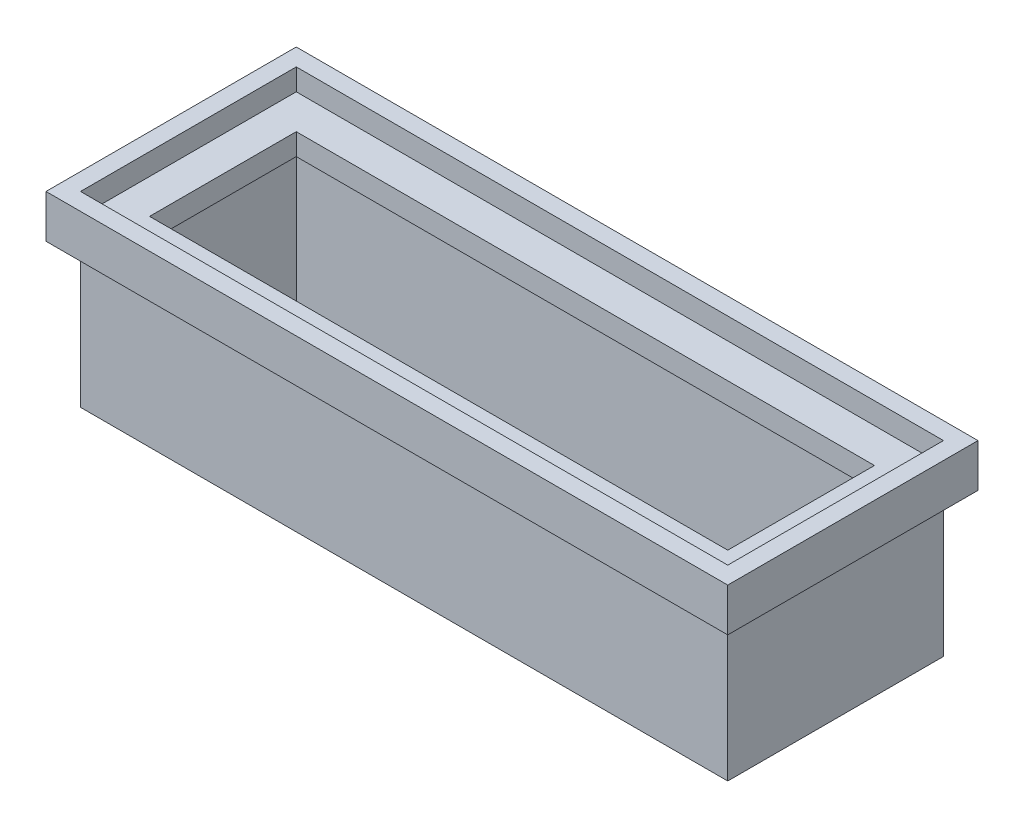
ISO-10303-21;
HEADER;
FILE_DESCRIPTION(('STEP AP214'),'2;1');
FILE_NAME('part.step','',(''),(''),'','','');
FILE_SCHEMA(('AUTOMOTIVE_DESIGN { 1 0 10303 214 1 1 1 1 }'));
ENDSEC;
DATA;
#1=APPLICATION_CONTEXT('core data for automotive mechanical design processes');
#2=APPLICATION_PROTOCOL_DEFINITION('international standard','automotive_design',2000,#1);
#3=PRODUCT_CONTEXT('',#1,'mechanical');
#4=PRODUCT('Part','Part','',(#3));
#5=PRODUCT_RELATED_PRODUCT_CATEGORY('part','',(#4));
#6=PRODUCT_DEFINITION_FORMATION('','',#4);
#7=PRODUCT_DEFINITION_CONTEXT('part definition',#1,'design');
#8=PRODUCT_DEFINITION('design','',#6,#7);
#9=PRODUCT_DEFINITION_SHAPE('','',#8);
#10=(LENGTH_UNIT() NAMED_UNIT(*) SI_UNIT(.MILLI.,.METRE.));
#11=(NAMED_UNIT(*) PLANE_ANGLE_UNIT() SI_UNIT($,.RADIAN.));
#12=(NAMED_UNIT(*) SI_UNIT($,.STERADIAN.) SOLID_ANGLE_UNIT());
#13=UNCERTAINTY_MEASURE_WITH_UNIT(LENGTH_MEASURE(1.E-05),#10,'distance_accuracy_value','');
#14=(GEOMETRIC_REPRESENTATION_CONTEXT(3) GLOBAL_UNCERTAINTY_ASSIGNED_CONTEXT((#13)) GLOBAL_UNIT_ASSIGNED_CONTEXT((#10,
#11,#12)) REPRESENTATION_CONTEXT('',''));
#15=CARTESIAN_POINT('',(0.,0.,0.));
#16=DIRECTION('',(0.,0.,1.));
#17=DIRECTION('',(1.,0.,0.));
#18=AXIS2_PLACEMENT_3D('',#15,#16,#17);
#19=CARTESIAN_POINT('',(0.,13.,0.));
#20=DIRECTION('',(0.,1.,0.));
#21=DIRECTION('',(0.,0.,1.));
#22=AXIS2_PLACEMENT_3D('',#19,#20,#21);
#23=PLANE('',#22);
#24=DIRECTION('',(0.,0.,1.));
#25=VECTOR('',#24,1.);
#26=CARTESIAN_POINT('',(-29.2763157894737,13.,-7.74736842105263));
#27=LINE('',#26,#25);
#28=CARTESIAN_POINT('',(-29.2763157894737,13.,-11.3473684210526));
#29=VERTEX_POINT('',#28);
#30=CARTESIAN_POINT('',(-29.2763157894737,13.,6.05263157894737));
#31=VERTEX_POINT('',#30);
#32=EDGE_CURVE('E271',#29,#31,#27,.T.);
#33=ORIENTED_EDGE('',*,*,#32,.T.);
#34=DIRECTION('',(1.,0.,0.));
#35=VECTOR('',#34,1.);
#36=CARTESIAN_POINT('',(-25.6763157894737,13.,6.05263157894737));
#37=LINE('',#36,#35);
#38=CARTESIAN_POINT('',(18.1236842105263,13.,6.05263157894737));
#39=VERTEX_POINT('',#38);
#40=EDGE_CURVE('E274',#31,#39,#37,.T.);
#41=ORIENTED_EDGE('',*,*,#40,.T.);
#42=DIRECTION('',(0.,0.,1.));
#43=VECTOR('',#42,1.);
#44=CARTESIAN_POINT('',(18.1236842105263,13.,-7.74736842105263));
#45=LINE('',#44,#43);
#46=CARTESIAN_POINT('',(18.1236842105263,13.,-11.3473684210526));
#47=VERTEX_POINT('',#46);
#48=EDGE_CURVE('E277',#47,#39,#45,.T.);
#49=ORIENTED_EDGE('',*,*,#48,.F.);
#50=DIRECTION('',(1.,0.,0.));
#51=VECTOR('',#50,1.);
#52=CARTESIAN_POINT('',(-25.6763157894737,13.,-11.3473684210526));
#53=LINE('',#52,#51);
#54=EDGE_CURVE('E280',#29,#47,#53,.T.);
#55=ORIENTED_EDGE('',*,*,#54,.F.);
#56=EDGE_LOOP('',(#33,#41,#49,#55));
#57=FACE_BOUND('',#56,.T.);
#58=DIRECTION('',(0.,0.,1.));
#59=VECTOR('',#58,1.);
#60=CARTESIAN_POINT('',(-28.0763157894737,13.,-10.1473684210526));
#61=LINE('',#60,#59);
#62=CARTESIAN_POINT('',(-28.0763157894737,13.,-10.1473684210526));
#63=VERTEX_POINT('',#62);
#64=CARTESIAN_POINT('',(-28.0763157894737,13.,4.85263157894737));
#65=VERTEX_POINT('',#64);
#66=EDGE_CURVE('E233',#63,#65,#61,.T.);
#67=ORIENTED_EDGE('',*,*,#66,.F.);
#68=DIRECTION('',(1.,0.,0.));
#69=VECTOR('',#68,1.);
#70=CARTESIAN_POINT('',(-28.0763157894737,13.,-10.1473684210526));
#71=LINE('',#70,#69);
#72=CARTESIAN_POINT('',(16.9236842105263,13.,-10.1473684210526));
#73=VERTEX_POINT('',#72);
#74=EDGE_CURVE('E96',#63,#73,#71,.T.);
#75=ORIENTED_EDGE('',*,*,#74,.T.);
#76=DIRECTION('',(0.,0.,1.));
#77=VECTOR('',#76,1.);
#78=CARTESIAN_POINT('',(16.9236842105263,13.,-10.1473684210526));
#79=LINE('',#78,#77);
#80=CARTESIAN_POINT('',(16.9236842105263,13.,4.85263157894737));
#81=VERTEX_POINT('',#80);
#82=EDGE_CURVE('E237',#73,#81,#79,.T.);
#83=ORIENTED_EDGE('',*,*,#82,.T.);
#84=DIRECTION('',(1.,0.,0.));
#85=VECTOR('',#84,1.);
#86=CARTESIAN_POINT('',(-28.0763157894737,13.,4.85263157894737));
#87=LINE('',#86,#85);
#88=EDGE_CURVE('E642',#65,#81,#87,.T.);
#89=ORIENTED_EDGE('',*,*,#88,.F.);
#90=EDGE_LOOP('',(#67,#75,#83,#89));
#91=FACE_BOUND('',#90,.T.);
#92=ADVANCED_FACE('F81',(#57,#91),#23,.T.);
#93=CARTESIAN_POINT('',(0.,0.,0.));
#94=DIRECTION('',(0.,1.,0.));
#95=DIRECTION('',(0.,0.,1.));
#96=AXIS2_PLACEMENT_3D('',#93,#94,#95);
#97=PLANE('',#96);
#98=DIRECTION('',(0.,0.,1.));
#99=VECTOR('',#98,1.);
#100=CARTESIAN_POINT('',(-28.0763157894737,0.,-8.94736842105263));
#101=LINE('',#100,#99);
#102=CARTESIAN_POINT('',(-28.0763157894737,0.,-10.1473684210526));
#103=VERTEX_POINT('',#102);
#104=CARTESIAN_POINT('',(-28.0763157894737,0.,4.85263157894737));
#105=VERTEX_POINT('',#104);
#106=EDGE_CURVE('E335',#103,#105,#101,.T.);
#107=ORIENTED_EDGE('',*,*,#106,.F.);
#108=DIRECTION('',(1.,0.,0.));
#109=VECTOR('',#108,1.);
#110=CARTESIAN_POINT('',(-26.8763157894737,0.,-10.1473684210526));
#111=LINE('',#110,#109);
#112=CARTESIAN_POINT('',(16.9236842105263,0.,-10.1473684210526));
#113=VERTEX_POINT('',#112);
#114=EDGE_CURVE('E339',#103,#113,#111,.T.);
#115=ORIENTED_EDGE('',*,*,#114,.T.);
#116=DIRECTION('',(0.,0.,1.));
#117=VECTOR('',#116,1.);
#118=CARTESIAN_POINT('',(16.9236842105263,0.,-8.94736842105263));
#119=LINE('',#118,#117);
#120=CARTESIAN_POINT('',(16.9236842105263,0.,4.85263157894737));
#121=VERTEX_POINT('',#120);
#122=EDGE_CURVE('E353',#113,#121,#119,.T.);
#123=ORIENTED_EDGE('',*,*,#122,.T.);
#124=DIRECTION('',(1.,0.,0.));
#125=VECTOR('',#124,1.);
#126=CARTESIAN_POINT('',(-26.8763157894737,0.,4.85263157894737));
#127=LINE('',#126,#125);
#128=EDGE_CURVE('E350',#105,#121,#127,.T.);
#129=ORIENTED_EDGE('',*,*,#128,.F.);
#130=EDGE_LOOP('',(#107,#115,#123,#129));
#131=FACE_BOUND('',#130,.T.);
#132=DIRECTION('',(0.,0.,1.));
#133=VECTOR('',#132,1.);
#134=CARTESIAN_POINT('',(-26.8763157894737,0.,-8.94736842105263));
#135=LINE('',#134,#133);
#136=CARTESIAN_POINT('',(-26.8763157894737,0.,-8.94736842105263));
#137=VERTEX_POINT('',#136);
#138=CARTESIAN_POINT('',(-26.8763157894737,0.,3.65263157894737));
#139=VERTEX_POINT('',#138);
#140=EDGE_CURVE('E302',#137,#139,#135,.T.);
#141=ORIENTED_EDGE('',*,*,#140,.T.);
#142=DIRECTION('',(1.,0.,0.));
#143=VECTOR('',#142,1.);
#144=CARTESIAN_POINT('',(-26.8763157894737,0.,3.65263157894737));
#145=LINE('',#144,#143);
#146=CARTESIAN_POINT('',(15.7236842105263,0.,3.65263157894737));
#147=VERTEX_POINT('',#146);
#148=EDGE_CURVE('E318',#139,#147,#145,.T.);
#149=ORIENTED_EDGE('',*,*,#148,.T.);
#150=DIRECTION('',(0.,0.,1.));
#151=VECTOR('',#150,1.);
#152=CARTESIAN_POINT('',(15.7236842105263,0.,-8.94736842105263));
#153=LINE('',#152,#151);
#154=CARTESIAN_POINT('',(15.7236842105263,0.,-8.94736842105263));
#155=VERTEX_POINT('',#154);
#156=EDGE_CURVE('E321',#155,#147,#153,.T.);
#157=ORIENTED_EDGE('',*,*,#156,.F.);
#158=DIRECTION('',(1.,0.,0.));
#159=VECTOR('',#158,1.);
#160=CARTESIAN_POINT('',(-26.8763157894737,0.,-8.94736842105263));
#161=LINE('',#160,#159);
#162=EDGE_CURVE('E306',#137,#155,#161,.T.);
#163=ORIENTED_EDGE('',*,*,#162,.F.);
#164=EDGE_LOOP('',(#141,#149,#157,#163));
#165=FACE_BOUND('',#164,.T.);
#166=ADVANCED_FACE('F374',(#131,#165),#97,.F.);
#167=CARTESIAN_POINT('',(-28.0763157894737,10.,-8.94736842105263));
#168=DIRECTION('',(1.,0.,0.));
#169=DIRECTION('',(0.,0.,-1.));
#170=AXIS2_PLACEMENT_3D('',#167,#168,#169);
#171=PLANE('',#170);
#172=ORIENTED_EDGE('',*,*,#106,.T.);
#173=DIRECTION('',(0.,-1.,0.));
#174=VECTOR('',#173,1.);
#175=CARTESIAN_POINT('',(-28.0763157894737,10.,4.85263157894737));
#176=LINE('',#175,#174);
#177=CARTESIAN_POINT('',(-28.0763157894737,10.,4.85263157894737));
#178=VERTEX_POINT('',#177);
#179=EDGE_CURVE('E89',#178,#105,#176,.T.);
#180=ORIENTED_EDGE('',*,*,#179,.F.);
#181=DIRECTION('',(0.,0.,1.));
#182=VECTOR('',#181,1.);
#183=CARTESIAN_POINT('',(-28.0763157894737,10.,-8.94736842105263));
#184=LINE('',#183,#182);
#185=CARTESIAN_POINT('',(-28.0763157894737,10.,-10.1473684210526));
#186=VERTEX_POINT('',#185);
#187=EDGE_CURVE('E336',#186,#178,#184,.T.);
#188=ORIENTED_EDGE('',*,*,#187,.F.);
#189=DIRECTION('',(0.,-1.,0.));
#190=VECTOR('',#189,1.);
#191=CARTESIAN_POINT('',(-28.0763157894737,10.,-10.1473684210526));
#192=LINE('',#191,#190);
#193=EDGE_CURVE('E347',#186,#103,#192,.T.);
#194=ORIENTED_EDGE('',*,*,#193,.T.);
#195=EDGE_LOOP('',(#172,#180,#188,#194));
#196=FACE_BOUND('',#195,.T.);
#197=ADVANCED_FACE('F83',(#196),#171,.F.);
#198=CARTESIAN_POINT('',(-26.8763157894737,10.,4.85263157894737));
#199=DIRECTION('',(0.,0.,-1.));
#200=DIRECTION('',(-1.,0.,0.));
#201=AXIS2_PLACEMENT_3D('',#198,#199,#200);
#202=PLANE('',#201);
#203=ORIENTED_EDGE('',*,*,#128,.T.);
#204=DIRECTION('',(0.,-1.,0.));
#205=VECTOR('',#204,1.);
#206=CARTESIAN_POINT('',(16.9236842105263,10.,4.85263157894737));
#207=LINE('',#206,#205);
#208=CARTESIAN_POINT('',(16.9236842105263,10.,4.85263157894737));
#209=VERTEX_POINT('',#208);
#210=EDGE_CURVE('E361',#209,#121,#207,.T.);
#211=ORIENTED_EDGE('',*,*,#210,.F.);
#212=DIRECTION('',(1.,0.,0.));
#213=VECTOR('',#212,1.);
#214=CARTESIAN_POINT('',(-26.8763157894737,10.,4.85263157894737));
#215=LINE('',#214,#213);
#216=EDGE_CURVE('E338',#178,#209,#215,.T.);
#217=ORIENTED_EDGE('',*,*,#216,.F.);
#218=ORIENTED_EDGE('',*,*,#179,.T.);
#219=EDGE_LOOP('',(#203,#211,#217,#218));
#220=FACE_BOUND('',#219,.T.);
#221=ADVANCED_FACE('F366',(#220),#202,.F.);
#222=CARTESIAN_POINT('',(16.9236842105263,10.,-8.94736842105263));
#223=DIRECTION('',(1.,0.,0.));
#224=DIRECTION('',(0.,0.,-1.));
#225=AXIS2_PLACEMENT_3D('',#222,#223,#224);
#226=PLANE('',#225);
#227=ORIENTED_EDGE('',*,*,#122,.F.);
#228=DIRECTION('',(0.,-1.,0.));
#229=VECTOR('',#228,1.);
#230=CARTESIAN_POINT('',(16.9236842105263,10.,-10.1473684210526));
#231=LINE('',#230,#229);
#232=CARTESIAN_POINT('',(16.9236842105263,10.,-10.1473684210526));
#233=VERTEX_POINT('',#232);
#234=EDGE_CURVE('E359',#233,#113,#231,.T.);
#235=ORIENTED_EDGE('',*,*,#234,.F.);
#236=DIRECTION('',(0.,0.,1.));
#237=VECTOR('',#236,1.);
#238=CARTESIAN_POINT('',(16.9236842105263,10.,-8.94736842105263));
#239=LINE('',#238,#237);
#240=EDGE_CURVE('E341',#233,#209,#239,.T.);
#241=ORIENTED_EDGE('',*,*,#240,.T.);
#242=ORIENTED_EDGE('',*,*,#210,.T.);
#243=EDGE_LOOP('',(#227,#235,#241,#242));
#244=FACE_BOUND('',#243,.T.);
#245=ADVANCED_FACE('F381',(#244),#226,.T.);
#246=CARTESIAN_POINT('',(-26.8763157894737,10.,-10.1473684210526));
#247=DIRECTION('',(0.,0.,-1.));
#248=DIRECTION('',(-1.,0.,0.));
#249=AXIS2_PLACEMENT_3D('',#246,#247,#248);
#250=PLANE('',#249);
#251=ORIENTED_EDGE('',*,*,#114,.F.);
#252=ORIENTED_EDGE('',*,*,#193,.F.);
#253=DIRECTION('',(1.,0.,0.));
#254=VECTOR('',#253,1.);
#255=CARTESIAN_POINT('',(-26.8763157894737,10.,-10.1473684210526));
#256=LINE('',#255,#254);
#257=EDGE_CURVE('E344',#186,#233,#256,.T.);
#258=ORIENTED_EDGE('',*,*,#257,.T.);
#259=ORIENTED_EDGE('',*,*,#234,.T.);
#260=EDGE_LOOP('',(#251,#252,#258,#259));
#261=FACE_BOUND('',#260,.T.);
#262=ADVANCED_FACE('F377',(#261),#250,.T.);
#263=CARTESIAN_POINT('',(-26.8763157894737,10.,-8.94736842105263));
#264=DIRECTION('',(1.,0.,0.));
#265=DIRECTION('',(0.,0.,-1.));
#266=AXIS2_PLACEMENT_3D('',#263,#264,#265);
#267=PLANE('',#266);
#268=ORIENTED_EDGE('',*,*,#140,.F.);
#269=DIRECTION('',(0.,-1.,0.));
#270=VECTOR('',#269,1.);
#271=CARTESIAN_POINT('',(-26.8763157894737,10.,-8.94736842105263));
#272=LINE('',#271,#270);
#273=CARTESIAN_POINT('',(-26.8763157894737,10.,-8.94736842105263));
#274=VERTEX_POINT('',#273);
#275=EDGE_CURVE('E315',#274,#137,#272,.T.);
#276=ORIENTED_EDGE('',*,*,#275,.F.);
#277=DIRECTION('',(0.,0.,1.));
#278=VECTOR('',#277,1.);
#279=CARTESIAN_POINT('',(-26.8763157894737,10.,-8.94736842105263));
#280=LINE('',#279,#278);
#281=CARTESIAN_POINT('',(-26.8763157894737,10.,3.65263157894737));
#282=VERTEX_POINT('',#281);
#283=EDGE_CURVE('E303',#274,#282,#280,.T.);
#284=ORIENTED_EDGE('',*,*,#283,.T.);
#285=DIRECTION('',(0.,-1.,0.));
#286=VECTOR('',#285,1.);
#287=CARTESIAN_POINT('',(-26.8763157894737,10.,3.65263157894737));
#288=LINE('',#287,#286);
#289=EDGE_CURVE('E332',#282,#139,#288,.T.);
#290=ORIENTED_EDGE('',*,*,#289,.T.);
#291=EDGE_LOOP('',(#268,#276,#284,#290));
#292=FACE_BOUND('',#291,.T.);
#293=ADVANCED_FACE('F535',(#292),#267,.T.);
#294=CARTESIAN_POINT('',(-26.8763157894737,10.,3.65263157894737));
#295=DIRECTION('',(0.,0.,-1.));
#296=DIRECTION('',(-1.,0.,0.));
#297=AXIS2_PLACEMENT_3D('',#294,#295,#296);
#298=PLANE('',#297);
#299=ORIENTED_EDGE('',*,*,#148,.F.);
#300=ORIENTED_EDGE('',*,*,#289,.F.);
#301=DIRECTION('',(1.,0.,0.));
#302=VECTOR('',#301,1.);
#303=CARTESIAN_POINT('',(-26.8763157894737,10.,3.65263157894737));
#304=LINE('',#303,#302);
#305=CARTESIAN_POINT('',(15.7236842105263,10.,3.65263157894737));
#306=VERTEX_POINT('',#305);
#307=EDGE_CURVE('E305',#282,#306,#304,.T.);
#308=ORIENTED_EDGE('',*,*,#307,.T.);
#309=DIRECTION('',(0.,-1.,0.));
#310=VECTOR('',#309,1.);
#311=CARTESIAN_POINT('',(15.7236842105263,10.,3.65263157894737));
#312=LINE('',#311,#310);
#313=EDGE_CURVE('E330',#306,#147,#312,.T.);
#314=ORIENTED_EDGE('',*,*,#313,.T.);
#315=EDGE_LOOP('',(#299,#300,#308,#314));
#316=FACE_BOUND('',#315,.T.);
#317=ADVANCED_FACE('F525',(#316),#298,.T.);
#318=CARTESIAN_POINT('',(15.7236842105263,10.,-8.94736842105263));
#319=DIRECTION('',(1.,0.,0.));
#320=DIRECTION('',(0.,0.,-1.));
#321=AXIS2_PLACEMENT_3D('',#318,#319,#320);
#322=PLANE('',#321);
#323=ORIENTED_EDGE('',*,*,#156,.T.);
#324=ORIENTED_EDGE('',*,*,#313,.F.);
#325=DIRECTION('',(0.,0.,1.));
#326=VECTOR('',#325,1.);
#327=CARTESIAN_POINT('',(15.7236842105263,10.,-8.94736842105263));
#328=LINE('',#327,#326);
#329=CARTESIAN_POINT('',(15.7236842105263,10.,-8.94736842105263));
#330=VERTEX_POINT('',#329);
#331=EDGE_CURVE('E309',#330,#306,#328,.T.);
#332=ORIENTED_EDGE('',*,*,#331,.F.);
#333=DIRECTION('',(0.,-1.,0.));
#334=VECTOR('',#333,1.);
#335=CARTESIAN_POINT('',(15.7236842105263,10.,-8.94736842105263));
#336=LINE('',#335,#334);
#337=EDGE_CURVE('E328',#330,#155,#336,.T.);
#338=ORIENTED_EDGE('',*,*,#337,.T.);
#339=EDGE_LOOP('',(#323,#324,#332,#338));
#340=FACE_BOUND('',#339,.T.);
#341=ADVANCED_FACE('F395',(#340),#322,.F.);
#342=CARTESIAN_POINT('',(-26.8763157894737,10.,-8.94736842105263));
#343=DIRECTION('',(0.,0.,-1.));
#344=DIRECTION('',(-1.,0.,0.));
#345=AXIS2_PLACEMENT_3D('',#342,#343,#344);
#346=PLANE('',#345);
#347=ORIENTED_EDGE('',*,*,#162,.T.);
#348=ORIENTED_EDGE('',*,*,#337,.F.);
#349=DIRECTION('',(1.,0.,0.));
#350=VECTOR('',#349,1.);
#351=CARTESIAN_POINT('',(-26.8763157894737,10.,-8.94736842105263));
#352=LINE('',#351,#350);
#353=EDGE_CURVE('E312',#274,#330,#352,.T.);
#354=ORIENTED_EDGE('',*,*,#353,.F.);
#355=ORIENTED_EDGE('',*,*,#275,.T.);
#356=EDGE_LOOP('',(#347,#348,#354,#355));
#357=FACE_BOUND('',#356,.T.);
#358=ADVANCED_FACE('F386',(#357),#346,.F.);
#359=CARTESIAN_POINT('',(0.,10.,0.));
#360=DIRECTION('',(0.,1.,0.));
#361=DIRECTION('',(0.,0.,1.));
#362=AXIS2_PLACEMENT_3D('',#359,#360,#361);
#363=PLANE('',#362);
#364=DIRECTION('',(0.,0.,1.));
#365=VECTOR('',#364,1.);
#366=CARTESIAN_POINT('',(-29.2763157894737,10.,-7.74736842105263));
#367=LINE('',#366,#365);
#368=CARTESIAN_POINT('',(-29.2763157894737,10.,-11.3473684210526));
#369=VERTEX_POINT('',#368);
#370=CARTESIAN_POINT('',(-29.2763157894737,10.,6.05263157894737));
#371=VERTEX_POINT('',#370);
#372=EDGE_CURVE('E270',#369,#371,#367,.T.);
#373=ORIENTED_EDGE('',*,*,#372,.F.);
#374=DIRECTION('',(1.,0.,0.));
#375=VECTOR('',#374,1.);
#376=CARTESIAN_POINT('',(-25.6763157894737,10.,-11.3473684210526));
#377=LINE('',#376,#375);
#378=CARTESIAN_POINT('',(18.1236842105263,10.,-11.3473684210526));
#379=VERTEX_POINT('',#378);
#380=EDGE_CURVE('E275',#369,#379,#377,.T.);
#381=ORIENTED_EDGE('',*,*,#380,.T.);
#382=DIRECTION('',(0.,0.,1.));
#383=VECTOR('',#382,1.);
#384=CARTESIAN_POINT('',(18.1236842105263,10.,-7.74736842105263));
#385=LINE('',#384,#383);
#386=CARTESIAN_POINT('',(18.1236842105263,10.,6.05263157894737));
#387=VERTEX_POINT('',#386);
#388=EDGE_CURVE('E289',#379,#387,#385,.T.);
#389=ORIENTED_EDGE('',*,*,#388,.T.);
#390=DIRECTION('',(1.,0.,0.));
#391=VECTOR('',#390,1.);
#392=CARTESIAN_POINT('',(-25.6763157894737,10.,6.05263157894737));
#393=LINE('',#392,#391);
#394=EDGE_CURVE('E286',#371,#387,#393,.T.);
#395=ORIENTED_EDGE('',*,*,#394,.F.);
#396=EDGE_LOOP('',(#373,#381,#389,#395));
#397=FACE_BOUND('',#396,.T.);
#398=ORIENTED_EDGE('',*,*,#257,.F.);
#399=ORIENTED_EDGE('',*,*,#187,.T.);
#400=ORIENTED_EDGE('',*,*,#216,.T.);
#401=ORIENTED_EDGE('',*,*,#240,.F.);
#402=EDGE_LOOP('',(#398,#399,#400,#401));
#403=FACE_BOUND('',#402,.T.);
#404=ADVANCED_FACE('F383',(#397,#403),#363,.F.);
#405=ORIENTED_EDGE('',*,*,#307,.F.);
#406=ORIENTED_EDGE('',*,*,#283,.F.);
#407=ORIENTED_EDGE('',*,*,#353,.T.);
#408=ORIENTED_EDGE('',*,*,#331,.T.);
#409=EDGE_LOOP('',(#405,#406,#407,#408));
#410=FACE_BOUND('',#409,.T.);
#411=DIRECTION('',(0.,0.,1.));
#412=VECTOR('',#411,1.);
#413=CARTESIAN_POINT('',(-25.6763157894737,10.,-7.74736842105263));
#414=LINE('',#413,#412);
#415=CARTESIAN_POINT('',(-25.6763157894737,10.,-7.74736842105263));
#416=VERTEX_POINT('',#415);
#417=CARTESIAN_POINT('',(-25.6763157894737,10.,2.45263157894737));
#418=VERTEX_POINT('',#417);
#419=EDGE_CURVE('E250',#416,#418,#414,.T.);
#420=ORIENTED_EDGE('',*,*,#419,.T.);
#421=DIRECTION('',(1.,0.,0.));
#422=VECTOR('',#421,1.);
#423=CARTESIAN_POINT('',(-25.6763157894737,10.,2.45263157894737));
#424=LINE('',#423,#422);
#425=CARTESIAN_POINT('',(14.5236842105263,10.,2.45263157894737));
#426=VERTEX_POINT('',#425);
#427=EDGE_CURVE('E253',#418,#426,#424,.T.);
#428=ORIENTED_EDGE('',*,*,#427,.T.);
#429=DIRECTION('',(0.,0.,1.));
#430=VECTOR('',#429,1.);
#431=CARTESIAN_POINT('',(14.5236842105263,10.,-7.74736842105263));
#432=LINE('',#431,#430);
#433=CARTESIAN_POINT('',(14.5236842105263,10.,-7.74736842105263));
#434=VERTEX_POINT('',#433);
#435=EDGE_CURVE('E256',#434,#426,#432,.T.);
#436=ORIENTED_EDGE('',*,*,#435,.F.);
#437=DIRECTION('',(1.,0.,0.));
#438=VECTOR('',#437,1.);
#439=CARTESIAN_POINT('',(-25.6763157894737,10.,-7.74736842105263));
#440=LINE('',#439,#438);
#441=EDGE_CURVE('E259',#416,#434,#440,.T.);
#442=ORIENTED_EDGE('',*,*,#441,.F.);
#443=EDGE_LOOP('',(#420,#428,#436,#442));
#444=FACE_BOUND('',#443,.T.);
#445=ADVANCED_FACE('F385',(#410,#444),#363,.F.);
#446=CARTESIAN_POINT('',(-29.2763157894737,13.,-7.74736842105263));
#447=DIRECTION('',(1.,0.,0.));
#448=DIRECTION('',(0.,0.,-1.));
#449=AXIS2_PLACEMENT_3D('',#446,#447,#448);
#450=PLANE('',#449);
#451=ORIENTED_EDGE('',*,*,#372,.T.);
#452=DIRECTION('',(0.,-1.,0.));
#453=VECTOR('',#452,1.);
#454=CARTESIAN_POINT('',(-29.2763157894737,13.,6.05263157894737));
#455=LINE('',#454,#453);
#456=EDGE_CURVE('E299',#31,#371,#455,.T.);
#457=ORIENTED_EDGE('',*,*,#456,.F.);
#458=ORIENTED_EDGE('',*,*,#32,.F.);
#459=DIRECTION('',(0.,-1.,0.));
#460=VECTOR('',#459,1.);
#461=CARTESIAN_POINT('',(-29.2763157894737,13.,-11.3473684210526));
#462=LINE('',#461,#460);
#463=EDGE_CURVE('E283',#29,#369,#462,.T.);
#464=ORIENTED_EDGE('',*,*,#463,.T.);
#465=EDGE_LOOP('',(#451,#457,#458,#464));
#466=FACE_BOUND('',#465,.T.);
#467=ADVANCED_FACE('F393',(#466),#450,.F.);
#468=CARTESIAN_POINT('',(-25.6763157894737,13.,6.05263157894737));
#469=DIRECTION('',(0.,0.,-1.));
#470=DIRECTION('',(-1.,0.,0.));
#471=AXIS2_PLACEMENT_3D('',#468,#469,#470);
#472=PLANE('',#471);
#473=ORIENTED_EDGE('',*,*,#394,.T.);
#474=DIRECTION('',(0.,-1.,0.));
#475=VECTOR('',#474,1.);
#476=CARTESIAN_POINT('',(18.1236842105263,13.,6.05263157894737));
#477=LINE('',#476,#475);
#478=EDGE_CURVE('E297',#39,#387,#477,.T.);
#479=ORIENTED_EDGE('',*,*,#478,.F.);
#480=ORIENTED_EDGE('',*,*,#40,.F.);
#481=ORIENTED_EDGE('',*,*,#456,.T.);
#482=EDGE_LOOP('',(#473,#479,#480,#481));
#483=FACE_BOUND('',#482,.T.);
#484=ADVANCED_FACE('F486',(#483),#472,.F.);
#485=CARTESIAN_POINT('',(18.1236842105263,13.,-7.74736842105263));
#486=DIRECTION('',(1.,0.,0.));
#487=DIRECTION('',(0.,0.,-1.));
#488=AXIS2_PLACEMENT_3D('',#485,#486,#487);
#489=PLANE('',#488);
#490=ORIENTED_EDGE('',*,*,#388,.F.);
#491=DIRECTION('',(0.,-1.,0.));
#492=VECTOR('',#491,1.);
#493=CARTESIAN_POINT('',(18.1236842105263,13.,-11.3473684210526));
#494=LINE('',#493,#492);
#495=EDGE_CURVE('E295',#47,#379,#494,.T.);
#496=ORIENTED_EDGE('',*,*,#495,.F.);
#497=ORIENTED_EDGE('',*,*,#48,.T.);
#498=ORIENTED_EDGE('',*,*,#478,.T.);
#499=EDGE_LOOP('',(#490,#496,#497,#498));
#500=FACE_BOUND('',#499,.T.);
#501=ADVANCED_FACE('F479',(#500),#489,.T.);
#502=CARTESIAN_POINT('',(-25.6763157894737,13.,-11.3473684210526));
#503=DIRECTION('',(0.,0.,-1.));
#504=DIRECTION('',(-1.,0.,0.));
#505=AXIS2_PLACEMENT_3D('',#502,#503,#504);
#506=PLANE('',#505);
#507=ORIENTED_EDGE('',*,*,#380,.F.);
#508=ORIENTED_EDGE('',*,*,#463,.F.);
#509=ORIENTED_EDGE('',*,*,#54,.T.);
#510=ORIENTED_EDGE('',*,*,#495,.T.);
#511=EDGE_LOOP('',(#507,#508,#509,#510));
#512=FACE_BOUND('',#511,.T.);
#513=ADVANCED_FACE('F413',(#512),#506,.T.);
#514=CARTESIAN_POINT('',(-25.6763157894737,13.,-7.74736842105263));
#515=DIRECTION('',(1.,0.,0.));
#516=DIRECTION('',(0.,0.,-1.));
#517=AXIS2_PLACEMENT_3D('',#514,#515,#516);
#518=PLANE('',#517);
#519=DIRECTION('',(0.,0.,-1.));
#520=VECTOR('',#519,1.);
#521=CARTESIAN_POINT('',(-25.6763157894737,11.5,-7.74736842105263));
#522=LINE('',#521,#520);
#523=CARTESIAN_POINT('',(-25.6763157894737,11.5,2.45263157894737));
#524=VERTEX_POINT('',#523);
#525=CARTESIAN_POINT('',(-25.6763157894737,11.5,-7.74736842105263));
#526=VERTEX_POINT('',#525);
#527=EDGE_CURVE('E104',#524,#526,#522,.T.);
#528=ORIENTED_EDGE('',*,*,#527,.F.);
#529=DIRECTION('',(0.,-1.,0.));
#530=VECTOR('',#529,1.);
#531=CARTESIAN_POINT('',(-25.6763157894737,13.,2.45263157894737));
#532=LINE('',#531,#530);
#533=EDGE_CURVE('E268',#524,#418,#532,.T.);
#534=ORIENTED_EDGE('',*,*,#533,.T.);
#535=ORIENTED_EDGE('',*,*,#419,.F.);
#536=DIRECTION('',(0.,-1.,0.));
#537=VECTOR('',#536,1.);
#538=CARTESIAN_POINT('',(-25.6763157894737,13.,-7.74736842105263));
#539=LINE('',#538,#537);
#540=EDGE_CURVE('E262',#526,#416,#539,.T.);
#541=ORIENTED_EDGE('',*,*,#540,.F.);
#542=EDGE_LOOP('',(#528,#534,#535,#541));
#543=FACE_BOUND('',#542,.T.);
#544=ADVANCED_FACE('F409',(#543),#518,.T.);
#545=CARTESIAN_POINT('',(-25.6763157894737,13.,2.45263157894737));
#546=DIRECTION('',(0.,0.,-1.));
#547=DIRECTION('',(-1.,0.,0.));
#548=AXIS2_PLACEMENT_3D('',#545,#546,#547);
#549=PLANE('',#548);
#550=DIRECTION('',(-1.,0.,0.));
#551=VECTOR('',#550,1.);
#552=CARTESIAN_POINT('',(-25.6763157894737,11.5,2.45263157894737));
#553=LINE('',#552,#551);
#554=CARTESIAN_POINT('',(14.5236842105263,11.5,2.45263157894737));
#555=VERTEX_POINT('',#554);
#556=EDGE_CURVE('E242',#555,#524,#553,.T.);
#557=ORIENTED_EDGE('',*,*,#556,.F.);
#558=DIRECTION('',(0.,-1.,0.));
#559=VECTOR('',#558,1.);
#560=CARTESIAN_POINT('',(14.5236842105263,13.,2.45263157894737));
#561=LINE('',#560,#559);
#562=EDGE_CURVE('E266',#555,#426,#561,.T.);
#563=ORIENTED_EDGE('',*,*,#562,.T.);
#564=ORIENTED_EDGE('',*,*,#427,.F.);
#565=ORIENTED_EDGE('',*,*,#533,.F.);
#566=EDGE_LOOP('',(#557,#563,#564,#565));
#567=FACE_BOUND('',#566,.T.);
#568=ADVANCED_FACE('F412',(#567),#549,.T.);
#569=CARTESIAN_POINT('',(14.5236842105263,13.,-7.74736842105263));
#570=DIRECTION('',(1.,0.,0.));
#571=DIRECTION('',(0.,0.,-1.));
#572=AXIS2_PLACEMENT_3D('',#569,#570,#571);
#573=PLANE('',#572);
#574=ORIENTED_EDGE('',*,*,#562,.F.);
#575=DIRECTION('',(0.,0.,-1.));
#576=VECTOR('',#575,1.);
#577=CARTESIAN_POINT('',(14.5236842105263,11.5,-7.74736842105263));
#578=LINE('',#577,#576);
#579=CARTESIAN_POINT('',(14.5236842105263,11.5,-7.74736842105263));
#580=VERTEX_POINT('',#579);
#581=EDGE_CURVE('E238',#555,#580,#578,.T.);
#582=ORIENTED_EDGE('',*,*,#581,.T.);
#583=DIRECTION('',(0.,-1.,0.));
#584=VECTOR('',#583,1.);
#585=CARTESIAN_POINT('',(14.5236842105263,13.,-7.74736842105263));
#586=LINE('',#585,#584);
#587=EDGE_CURVE('E264',#580,#434,#586,.T.);
#588=ORIENTED_EDGE('',*,*,#587,.T.);
#589=ORIENTED_EDGE('',*,*,#435,.T.);
#590=EDGE_LOOP('',(#574,#582,#588,#589));
#591=FACE_BOUND('',#590,.T.);
#592=ADVANCED_FACE('F417',(#591),#573,.F.);
#593=CARTESIAN_POINT('',(-25.6763157894737,13.,-7.74736842105263));
#594=DIRECTION('',(0.,0.,-1.));
#595=DIRECTION('',(-1.,0.,0.));
#596=AXIS2_PLACEMENT_3D('',#593,#594,#595);
#597=PLANE('',#596);
#598=ORIENTED_EDGE('',*,*,#587,.F.);
#599=DIRECTION('',(-1.,0.,0.));
#600=VECTOR('',#599,1.);
#601=CARTESIAN_POINT('',(-25.6763157894737,11.5,-7.74736842105263));
#602=LINE('',#601,#600);
#603=EDGE_CURVE('E12',#580,#526,#602,.T.);
#604=ORIENTED_EDGE('',*,*,#603,.T.);
#605=ORIENTED_EDGE('',*,*,#540,.T.);
#606=ORIENTED_EDGE('',*,*,#441,.T.);
#607=EDGE_LOOP('',(#598,#604,#605,#606));
#608=FACE_BOUND('',#607,.T.);
#609=ADVANCED_FACE('F421',(#608),#597,.F.);
#610=CARTESIAN_POINT('',(-28.0763157894737,11.5,-10.1473684210526));
#611=DIRECTION('',(0.,0.,1.));
#612=DIRECTION('',(1.,0.,0.));
#613=AXIS2_PLACEMENT_3D('',#610,#611,#612);
#614=PLANE('',#613);
#615=ORIENTED_EDGE('',*,*,#74,.F.);
#616=DIRECTION('',(0.,1.,0.));
#617=VECTOR('',#616,1.);
#618=CARTESIAN_POINT('',(-28.0763157894737,11.5,-10.1473684210526));
#619=LINE('',#618,#617);
#620=CARTESIAN_POINT('',(-28.0763157894737,11.5,-10.1473684210526));
#621=VERTEX_POINT('',#620);
#622=EDGE_CURVE('E232',#621,#63,#619,.T.);
#623=ORIENTED_EDGE('',*,*,#622,.F.);
#624=DIRECTION('',(1.,0.,0.));
#625=VECTOR('',#624,1.);
#626=CARTESIAN_POINT('',(-28.0763157894737,11.5,-10.1473684210526));
#627=LINE('',#626,#625);
#628=CARTESIAN_POINT('',(16.9236842105263,11.5,-10.1473684210526));
#629=VERTEX_POINT('',#628);
#630=EDGE_CURVE('E222',#621,#629,#627,.T.);
#631=ORIENTED_EDGE('',*,*,#630,.T.);
#632=DIRECTION('',(0.,1.,0.));
#633=VECTOR('',#632,1.);
#634=CARTESIAN_POINT('',(16.9236842105263,11.5,-10.1473684210526));
#635=LINE('',#634,#633);
#636=EDGE_CURVE('E231',#629,#73,#635,.T.);
#637=ORIENTED_EDGE('',*,*,#636,.T.);
#638=EDGE_LOOP('',(#615,#623,#631,#637));
#639=FACE_BOUND('',#638,.T.);
#640=ADVANCED_FACE('F230',(#639),#614,.T.);
#641=CARTESIAN_POINT('',(16.9236842105263,11.5,-10.1473684210526));
#642=DIRECTION('',(-1.,0.,0.));
#643=DIRECTION('',(0.,0.,1.));
#644=AXIS2_PLACEMENT_3D('',#641,#642,#643);
#645=PLANE('',#644);
#646=ORIENTED_EDGE('',*,*,#82,.F.);
#647=ORIENTED_EDGE('',*,*,#636,.F.);
#648=DIRECTION('',(0.,0.,1.));
#649=VECTOR('',#648,1.);
#650=CARTESIAN_POINT('',(16.9236842105263,11.5,-10.1473684210526));
#651=LINE('',#650,#649);
#652=CARTESIAN_POINT('',(16.9236842105263,11.5,4.85263157894737));
#653=VERTEX_POINT('',#652);
#654=EDGE_CURVE('E218',#629,#653,#651,.T.);
#655=ORIENTED_EDGE('',*,*,#654,.T.);
#656=DIRECTION('',(0.,1.,0.));
#657=VECTOR('',#656,1.);
#658=CARTESIAN_POINT('',(16.9236842105263,11.5,4.85263157894737));
#659=LINE('',#658,#657);
#660=EDGE_CURVE('E239',#653,#81,#659,.T.);
#661=ORIENTED_EDGE('',*,*,#660,.T.);
#662=EDGE_LOOP('',(#646,#647,#655,#661));
#663=FACE_BOUND('',#662,.T.);
#664=ADVANCED_FACE('F235',(#663),#645,.T.);
#665=CARTESIAN_POINT('',(-28.0763157894737,11.5,4.85263157894737));
#666=DIRECTION('',(0.,0.,1.));
#667=DIRECTION('',(1.,0.,0.));
#668=AXIS2_PLACEMENT_3D('',#665,#666,#667);
#669=PLANE('',#668);
#670=ORIENTED_EDGE('',*,*,#88,.T.);
#671=ORIENTED_EDGE('',*,*,#660,.F.);
#672=DIRECTION('',(1.,0.,0.));
#673=VECTOR('',#672,1.);
#674=CARTESIAN_POINT('',(-28.0763157894737,11.5,4.85263157894737));
#675=LINE('',#674,#673);
#676=CARTESIAN_POINT('',(-28.0763157894737,11.5,4.85263157894737));
#677=VERTEX_POINT('',#676);
#678=EDGE_CURVE('E225',#677,#653,#675,.T.);
#679=ORIENTED_EDGE('',*,*,#678,.F.);
#680=DIRECTION('',(0.,1.,0.));
#681=VECTOR('',#680,1.);
#682=CARTESIAN_POINT('',(-28.0763157894737,11.5,4.85263157894737));
#683=LINE('',#682,#681);
#684=EDGE_CURVE('E244',#677,#65,#683,.T.);
#685=ORIENTED_EDGE('',*,*,#684,.T.);
#686=EDGE_LOOP('',(#670,#671,#679,#685));
#687=FACE_BOUND('',#686,.T.);
#688=ADVANCED_FACE('F430',(#687),#669,.F.);
#689=CARTESIAN_POINT('',(-28.0763157894737,11.5,-10.1473684210526));
#690=DIRECTION('',(-1.,0.,0.));
#691=DIRECTION('',(0.,0.,1.));
#692=AXIS2_PLACEMENT_3D('',#689,#690,#691);
#693=PLANE('',#692);
#694=ORIENTED_EDGE('',*,*,#66,.T.);
#695=ORIENTED_EDGE('',*,*,#684,.F.);
#696=DIRECTION('',(0.,0.,1.));
#697=VECTOR('',#696,1.);
#698=CARTESIAN_POINT('',(-28.0763157894737,11.5,-10.1473684210526));
#699=LINE('',#698,#697);
#700=EDGE_CURVE('E649',#621,#677,#699,.T.);
#701=ORIENTED_EDGE('',*,*,#700,.F.);
#702=ORIENTED_EDGE('',*,*,#622,.T.);
#703=EDGE_LOOP('',(#694,#695,#701,#702));
#704=FACE_BOUND('',#703,.T.);
#705=ADVANCED_FACE('F433',(#704),#693,.F.);
#706=CARTESIAN_POINT('',(0.,11.5,0.));
#707=DIRECTION('',(0.,-1.,0.));
#708=DIRECTION('',(0.,0.,-1.));
#709=AXIS2_PLACEMENT_3D('',#706,#707,#708);
#710=PLANE('',#709);
#711=ORIENTED_EDGE('',*,*,#527,.T.);
#712=ORIENTED_EDGE('',*,*,#603,.F.);
#713=ORIENTED_EDGE('',*,*,#581,.F.);
#714=ORIENTED_EDGE('',*,*,#556,.T.);
#715=EDGE_LOOP('',(#711,#712,#713,#714));
#716=FACE_BOUND('',#715,.T.);
#717=ORIENTED_EDGE('',*,*,#630,.F.);
#718=ORIENTED_EDGE('',*,*,#700,.T.);
#719=ORIENTED_EDGE('',*,*,#678,.T.);
#720=ORIENTED_EDGE('',*,*,#654,.F.);
#721=EDGE_LOOP('',(#717,#718,#719,#720));
#722=FACE_BOUND('',#721,.T.);
#723=ADVANCED_FACE('F220',(#716,#722),#710,.F.);
#724=CLOSED_SHELL('',(#92,#166,#197,#221,#245,#262,#293,#317,#341,#358,#404,#445,#467,#484,#501,
#513,#544,#568,#592,#609,#640,#664,#688,#705,#723));
#725=MANIFOLD_SOLID_BREP('B2',#724);
#726=ADVANCED_BREP_SHAPE_REPRESENTATION('',(#18,#725),#14);
#727=SHAPE_DEFINITION_REPRESENTATION(#9,#726);
ENDSEC;
END-ISO-10303-21;
